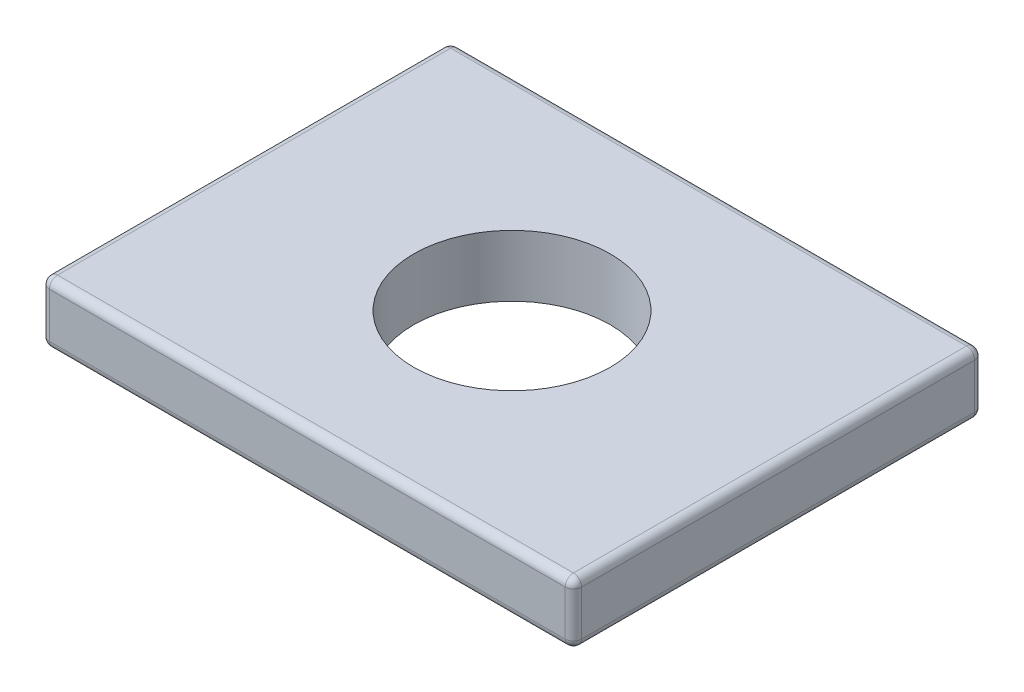
ISO-10303-21;
HEADER;
FILE_DESCRIPTION(('STEP AP214'),'2;1');
FILE_NAME('part.step','',(''),(''),'','','');
FILE_SCHEMA(('AUTOMOTIVE_DESIGN { 1 0 10303 214 1 1 1 1 }'));
ENDSEC;
DATA;
#1=APPLICATION_CONTEXT('core data for automotive mechanical design processes');
#2=APPLICATION_PROTOCOL_DEFINITION('international standard','automotive_design',2000,#1);
#3=PRODUCT_CONTEXT('',#1,'mechanical');
#4=PRODUCT('Part','Part','',(#3));
#5=PRODUCT_RELATED_PRODUCT_CATEGORY('part','',(#4));
#6=PRODUCT_DEFINITION_FORMATION('','',#4);
#7=PRODUCT_DEFINITION_CONTEXT('part definition',#1,'design');
#8=PRODUCT_DEFINITION('design','',#6,#7);
#9=PRODUCT_DEFINITION_SHAPE('','',#8);
#10=(LENGTH_UNIT() NAMED_UNIT(*) SI_UNIT(.MILLI.,.METRE.));
#11=(NAMED_UNIT(*) PLANE_ANGLE_UNIT() SI_UNIT($,.RADIAN.));
#12=(NAMED_UNIT(*) SI_UNIT($,.STERADIAN.) SOLID_ANGLE_UNIT());
#13=UNCERTAINTY_MEASURE_WITH_UNIT(LENGTH_MEASURE(1.E-05),#10,'distance_accuracy_value','');
#14=(GEOMETRIC_REPRESENTATION_CONTEXT(3) GLOBAL_UNCERTAINTY_ASSIGNED_CONTEXT((#13)) GLOBAL_UNIT_ASSIGNED_CONTEXT((#10,
#11,#12)) REPRESENTATION_CONTEXT('',''));
#15=CARTESIAN_POINT('',(0.,0.,0.));
#16=DIRECTION('',(0.,0.,1.));
#17=DIRECTION('',(1.,0.,0.));
#18=AXIS2_PLACEMENT_3D('',#15,#16,#17);
#19=CARTESIAN_POINT('',(-3.25,0.75,-2.5));
#20=DIRECTION('',(1.,0.,0.));
#21=DIRECTION('',(0.,0.,-1.));
#22=AXIS2_PLACEMENT_3D('',#19,#20,#21);
#23=PLANE('',#22);
#24=DIRECTION('',(0.,0.,1.));
#25=VECTOR('',#24,1.);
#26=CARTESIAN_POINT('',(-3.25,0.65,-2.5));
#27=LINE('',#26,#25);
#28=CARTESIAN_POINT('',(-3.25,0.65,2.4));
#29=VERTEX_POINT('',#28);
#30=CARTESIAN_POINT('',(-3.25,0.65,-2.4));
#31=VERTEX_POINT('',#30);
#32=EDGE_CURVE('E136',#29,#31,#27,.F.);
#33=ORIENTED_EDGE('',*,*,#32,.T.);
#34=DIRECTION('',(0.,-1.,0.));
#35=VECTOR('',#34,1.);
#36=CARTESIAN_POINT('',(-3.25,0.75,-2.4));
#37=LINE('',#36,#35);
#38=CARTESIAN_POINT('',(-3.25,0.1,-2.4));
#39=VERTEX_POINT('',#38);
#40=EDGE_CURVE('E183',#31,#39,#37,.T.);
#41=ORIENTED_EDGE('',*,*,#40,.T.);
#42=DIRECTION('',(0.,0.,1.));
#43=VECTOR('',#42,1.);
#44=CARTESIAN_POINT('',(-3.25,0.1,-2.5));
#45=LINE('',#44,#43);
#46=CARTESIAN_POINT('',(-3.25,0.1,2.4));
#47=VERTEX_POINT('',#46);
#48=EDGE_CURVE('E178',#39,#47,#45,.T.);
#49=ORIENTED_EDGE('',*,*,#48,.T.);
#50=DIRECTION('',(0.,-1.,0.));
#51=VECTOR('',#50,1.);
#52=CARTESIAN_POINT('',(-3.25,0.75,2.4));
#53=LINE('',#52,#51);
#54=EDGE_CURVE('E172',#47,#29,#53,.F.);
#55=ORIENTED_EDGE('',*,*,#54,.T.);
#56=EDGE_LOOP('',(#33,#41,#49,#55));
#57=FACE_BOUND('',#56,.T.);
#58=ADVANCED_FACE('F39',(#57),#23,.F.);
#59=CARTESIAN_POINT('',(-3.25,0.75,2.5));
#60=DIRECTION('',(0.,0.,-1.));
#61=DIRECTION('',(-1.,0.,0.));
#62=AXIS2_PLACEMENT_3D('',#59,#60,#61);
#63=PLANE('',#62);
#64=DIRECTION('',(1.,0.,0.));
#65=VECTOR('',#64,1.);
#66=CARTESIAN_POINT('',(-3.25,0.65,2.5));
#67=LINE('',#66,#65);
#68=CARTESIAN_POINT('',(3.15,0.65,2.5));
#69=VERTEX_POINT('',#68);
#70=CARTESIAN_POINT('',(-3.15,0.65,2.5));
#71=VERTEX_POINT('',#70);
#72=EDGE_CURVE('E49',#69,#71,#67,.F.);
#73=ORIENTED_EDGE('',*,*,#72,.T.);
#74=DIRECTION('',(0.,-1.,0.));
#75=VECTOR('',#74,1.);
#76=CARTESIAN_POINT('',(-3.15,0.75,2.5));
#77=LINE('',#76,#75);
#78=CARTESIAN_POINT('',(-3.15,0.1,2.5));
#79=VERTEX_POINT('',#78);
#80=EDGE_CURVE('E11',#71,#79,#77,.T.);
#81=ORIENTED_EDGE('',*,*,#80,.T.);
#82=DIRECTION('',(1.,0.,0.));
#83=VECTOR('',#82,1.);
#84=CARTESIAN_POINT('',(-3.25,0.1,2.5));
#85=LINE('',#84,#83);
#86=CARTESIAN_POINT('',(3.15,0.1,2.5));
#87=VERTEX_POINT('',#86);
#88=EDGE_CURVE('E225',#79,#87,#85,.T.);
#89=ORIENTED_EDGE('',*,*,#88,.T.);
#90=DIRECTION('',(0.,-1.,0.));
#91=VECTOR('',#90,1.);
#92=CARTESIAN_POINT('',(3.15,0.75,2.5));
#93=LINE('',#92,#91);
#94=EDGE_CURVE('E60',#87,#69,#93,.F.);
#95=ORIENTED_EDGE('',*,*,#94,.T.);
#96=EDGE_LOOP('',(#73,#81,#89,#95));
#97=FACE_BOUND('',#96,.T.);
#98=ADVANCED_FACE('F340',(#97),#63,.F.);
#99=CARTESIAN_POINT('',(3.25,0.75,-2.5));
#100=DIRECTION('',(-1.,0.,0.));
#101=DIRECTION('',(0.,0.,1.));
#102=AXIS2_PLACEMENT_3D('',#99,#100,#101);
#103=PLANE('',#102);
#104=DIRECTION('',(0.,0.,-1.));
#105=VECTOR('',#104,1.);
#106=CARTESIAN_POINT('',(3.25,0.1,-2.5));
#107=LINE('',#106,#105);
#108=CARTESIAN_POINT('',(3.25,0.1,2.4));
#109=VERTEX_POINT('',#108);
#110=CARTESIAN_POINT('',(3.25,0.1,-2.4));
#111=VERTEX_POINT('',#110);
#112=EDGE_CURVE('E202',#109,#111,#107,.T.);
#113=ORIENTED_EDGE('',*,*,#112,.T.);
#114=DIRECTION('',(0.,-1.,0.));
#115=VECTOR('',#114,1.);
#116=CARTESIAN_POINT('',(3.25,0.75,-2.4));
#117=LINE('',#116,#115);
#118=CARTESIAN_POINT('',(3.25,0.65,-2.4));
#119=VERTEX_POINT('',#118);
#120=EDGE_CURVE('E209',#111,#119,#117,.F.);
#121=ORIENTED_EDGE('',*,*,#120,.T.);
#122=DIRECTION('',(0.,0.,-1.));
#123=VECTOR('',#122,1.);
#124=CARTESIAN_POINT('',(3.25,0.65,2.5));
#125=LINE('',#124,#123);
#126=CARTESIAN_POINT('',(3.25,0.65,2.4));
#127=VERTEX_POINT('',#126);
#128=EDGE_CURVE('E205',#119,#127,#125,.F.);
#129=ORIENTED_EDGE('',*,*,#128,.T.);
#130=DIRECTION('',(0.,-1.,0.));
#131=VECTOR('',#130,1.);
#132=CARTESIAN_POINT('',(3.25,0.75,2.4));
#133=LINE('',#132,#131);
#134=EDGE_CURVE('E199',#127,#109,#133,.T.);
#135=ORIENTED_EDGE('',*,*,#134,.T.);
#136=EDGE_LOOP('',(#113,#121,#129,#135));
#137=FACE_BOUND('',#136,.T.);
#138=ADVANCED_FACE('F346',(#137),#103,.F.);
#139=CARTESIAN_POINT('',(-3.25,0.75,-2.5));
#140=DIRECTION('',(0.,0.,1.));
#141=DIRECTION('',(1.,0.,0.));
#142=AXIS2_PLACEMENT_3D('',#139,#140,#141);
#143=PLANE('',#142);
#144=DIRECTION('',(-1.,0.,0.));
#145=VECTOR('',#144,1.);
#146=CARTESIAN_POINT('',(3.25,0.65,-2.5));
#147=LINE('',#146,#145);
#148=CARTESIAN_POINT('',(-3.15,0.65,-2.5));
#149=VERTEX_POINT('',#148);
#150=CARTESIAN_POINT('',(3.15,0.65,-2.5));
#151=VERTEX_POINT('',#150);
#152=EDGE_CURVE('E218',#149,#151,#147,.F.);
#153=ORIENTED_EDGE('',*,*,#152,.T.);
#154=DIRECTION('',(0.,-1.,0.));
#155=VECTOR('',#154,1.);
#156=CARTESIAN_POINT('',(3.15,0.75,-2.5));
#157=LINE('',#156,#155);
#158=CARTESIAN_POINT('',(3.15,0.1,-2.5));
#159=VERTEX_POINT('',#158);
#160=EDGE_CURVE('E221',#151,#159,#157,.T.);
#161=ORIENTED_EDGE('',*,*,#160,.T.);
#162=DIRECTION('',(-1.,0.,0.));
#163=VECTOR('',#162,1.);
#164=CARTESIAN_POINT('',(-3.25,0.1,-2.5));
#165=LINE('',#164,#163);
#166=CARTESIAN_POINT('',(-3.15,0.1,-2.5));
#167=VERTEX_POINT('',#166);
#168=EDGE_CURVE('E212',#159,#167,#165,.T.);
#169=ORIENTED_EDGE('',*,*,#168,.T.);
#170=DIRECTION('',(0.,-1.,0.));
#171=VECTOR('',#170,1.);
#172=CARTESIAN_POINT('',(-3.15,0.75,-2.5));
#173=LINE('',#172,#171);
#174=EDGE_CURVE('E215',#167,#149,#173,.F.);
#175=ORIENTED_EDGE('',*,*,#174,.T.);
#176=EDGE_LOOP('',(#153,#161,#169,#175));
#177=FACE_BOUND('',#176,.T.);
#178=ADVANCED_FACE('F434',(#177),#143,.F.);
#179=CARTESIAN_POINT('',(0.,0.75,0.));
#180=DIRECTION('',(0.,1.,0.));
#181=DIRECTION('',(0.,0.,1.));
#182=AXIS2_PLACEMENT_3D('',#179,#180,#181);
#183=PLANE('',#182);
#184=DIRECTION('',(0.,0.,-1.));
#185=VECTOR('',#184,1.);
#186=CARTESIAN_POINT('',(3.15,0.75,-2.5));
#187=LINE('',#186,#185);
#188=CARTESIAN_POINT('',(3.15,0.75,2.4));
#189=VERTEX_POINT('',#188);
#190=CARTESIAN_POINT('',(3.15,0.75,-2.4));
#191=VERTEX_POINT('',#190);
#192=EDGE_CURVE('E160',#189,#191,#187,.T.);
#193=ORIENTED_EDGE('',*,*,#192,.T.);
#194=DIRECTION('',(-1.,0.,0.));
#195=VECTOR('',#194,1.);
#196=CARTESIAN_POINT('',(-3.25,0.75,-2.4));
#197=LINE('',#196,#195);
#198=CARTESIAN_POINT('',(-3.15,0.75,-2.4));
#199=VERTEX_POINT('',#198);
#200=EDGE_CURVE('E166',#191,#199,#197,.T.);
#201=ORIENTED_EDGE('',*,*,#200,.T.);
#202=DIRECTION('',(0.,0.,1.));
#203=VECTOR('',#202,1.);
#204=CARTESIAN_POINT('',(-3.15,0.75,2.5));
#205=LINE('',#204,#203);
#206=CARTESIAN_POINT('',(-3.15,0.75,2.4));
#207=VERTEX_POINT('',#206);
#208=EDGE_CURVE('E134',#199,#207,#205,.T.);
#209=ORIENTED_EDGE('',*,*,#208,.T.);
#210=DIRECTION('',(1.,0.,0.));
#211=VECTOR('',#210,1.);
#212=CARTESIAN_POINT('',(3.25,0.75,2.4));
#213=LINE('',#212,#211);
#214=EDGE_CURVE('E153',#207,#189,#213,.T.);
#215=ORIENTED_EDGE('',*,*,#214,.T.);
#216=EDGE_LOOP('',(#193,#201,#209,#215));
#217=FACE_BOUND('',#216,.T.);
#218=CARTESIAN_POINT('',(0.,0.750000000000001,0.));
#219=DIRECTION('',(0.,1.,0.));
#220=DIRECTION('',(0.,0.,1.));
#221=AXIS2_PLACEMENT_3D('',#218,#219,#220);
#222=CIRCLE('',#221,1.19999999999999);
#223=CARTESIAN_POINT('',(0.,0.750000000000001,1.19999999999999));
#224=VERTEX_POINT('',#223);
#225=EDGE_CURVE('E310',#224,#224,#222,.T.);
#226=ORIENTED_EDGE('',*,*,#225,.F.);
#227=EDGE_LOOP('',(#226));
#228=FACE_BOUND('',#227,.T.);
#229=ADVANCED_FACE('F163',(#217,#228),#183,.T.);
#230=CARTESIAN_POINT('',(0.,0.,0.));
#231=DIRECTION('',(0.,1.,0.));
#232=DIRECTION('',(0.,0.,1.));
#233=AXIS2_PLACEMENT_3D('',#230,#231,#232);
#234=PLANE('',#233);
#235=DIRECTION('',(0.,0.,1.));
#236=VECTOR('',#235,1.);
#237=CARTESIAN_POINT('',(-3.15,0.,0.));
#238=LINE('',#237,#236);
#239=CARTESIAN_POINT('',(-3.15,0.,2.4));
#240=VERTEX_POINT('',#239);
#241=CARTESIAN_POINT('',(-3.15,0.,-2.4));
#242=VERTEX_POINT('',#241);
#243=EDGE_CURVE('E192',#240,#242,#238,.F.);
#244=ORIENTED_EDGE('',*,*,#243,.T.);
#245=DIRECTION('',(-1.,0.,0.));
#246=VECTOR('',#245,1.);
#247=CARTESIAN_POINT('',(0.,0.,-2.4));
#248=LINE('',#247,#246);
#249=CARTESIAN_POINT('',(3.15,0.,-2.4));
#250=VERTEX_POINT('',#249);
#251=EDGE_CURVE('E196',#242,#250,#248,.F.);
#252=ORIENTED_EDGE('',*,*,#251,.T.);
#253=DIRECTION('',(0.,0.,-1.));
#254=VECTOR('',#253,1.);
#255=CARTESIAN_POINT('',(3.15,0.,0.));
#256=LINE('',#255,#254);
#257=CARTESIAN_POINT('',(3.15,0.,2.4));
#258=VERTEX_POINT('',#257);
#259=EDGE_CURVE('E189',#250,#258,#256,.F.);
#260=ORIENTED_EDGE('',*,*,#259,.T.);
#261=DIRECTION('',(1.,0.,0.));
#262=VECTOR('',#261,1.);
#263=CARTESIAN_POINT('',(0.,0.,2.4));
#264=LINE('',#263,#262);
#265=EDGE_CURVE('E186',#258,#240,#264,.F.);
#266=ORIENTED_EDGE('',*,*,#265,.T.);
#267=EDGE_LOOP('',(#244,#252,#260,#266));
#268=FACE_BOUND('',#267,.T.);
#269=CARTESIAN_POINT('',(0.,0.,0.));
#270=DIRECTION('',(0.,1.,0.));
#271=DIRECTION('',(0.,0.,1.));
#272=AXIS2_PLACEMENT_3D('',#269,#270,#271);
#273=CIRCLE('',#272,1.19999999999999);
#274=CARTESIAN_POINT('',(0.,0.,1.19999999999999));
#275=VERTEX_POINT('',#274);
#276=EDGE_CURVE('E161',#275,#275,#273,.T.);
#277=ORIENTED_EDGE('',*,*,#276,.T.);
#278=EDGE_LOOP('',(#277));
#279=FACE_BOUND('',#278,.T.);
#280=ADVANCED_FACE('F325',(#268,#279),#234,.F.);
#281=CARTESIAN_POINT('',(0.,0.75,0.));
#282=DIRECTION('',(0.,1.,0.));
#283=DIRECTION('',(0.,0.,1.));
#284=AXIS2_PLACEMENT_3D('',#281,#282,#283);
#285=CYLINDRICAL_SURFACE('',#284,1.19999999999999);
#286=ORIENTED_EDGE('',*,*,#225,.T.);
#287=EDGE_LOOP('',(#286));
#288=FACE_BOUND('',#287,.T.);
#289=ORIENTED_EDGE('',*,*,#276,.F.);
#290=EDGE_LOOP('',(#289));
#291=FACE_BOUND('',#290,.T.);
#292=ADVANCED_FACE('F327',(#288,#291),#285,.F.);
#293=CARTESIAN_POINT('',(3.15,0.1,-2.5));
#294=DIRECTION('',(0.,0.,-1.));
#295=DIRECTION('',(-1.,0.,0.));
#296=AXIS2_PLACEMENT_3D('',#293,#294,#295);
#297=CYLINDRICAL_SURFACE('',#296,0.1);
#298=CARTESIAN_POINT('',(3.15,0.1,-2.4));
#299=DIRECTION('',(0.,0.,-1.));
#300=DIRECTION('',(-1.,0.,0.));
#301=AXIS2_PLACEMENT_3D('',#298,#299,#300);
#302=CIRCLE('',#301,0.1);
#303=EDGE_CURVE('E43',#111,#250,#302,.T.);
#304=ORIENTED_EDGE('',*,*,#303,.F.);
#305=ORIENTED_EDGE('',*,*,#112,.F.);
#306=CARTESIAN_POINT('',(3.15,0.1,2.4));
#307=DIRECTION('',(0.,0.,1.));
#308=DIRECTION('',(1.,0.,0.));
#309=AXIS2_PLACEMENT_3D('',#306,#307,#308);
#310=CIRCLE('',#309,0.1);
#311=EDGE_CURVE('E301',#258,#109,#310,.T.);
#312=ORIENTED_EDGE('',*,*,#311,.F.);
#313=ORIENTED_EDGE('',*,*,#259,.F.);
#314=EDGE_LOOP('',(#304,#305,#312,#313));
#315=FACE_BOUND('',#314,.T.);
#316=ADVANCED_FACE('F41',(#315),#297,.T.);
#317=CARTESIAN_POINT('',(3.15,0.1,-2.4));
#318=DIRECTION('',(0.,0.,1.));
#319=DIRECTION('',(1.,0.,0.));
#320=AXIS2_PLACEMENT_3D('',#317,#318,#319);
#321=SPHERICAL_SURFACE('',#320,0.1);
#322=CARTESIAN_POINT('',(3.15,0.1,-2.4));
#323=DIRECTION('',(0.,-1.,0.));
#324=DIRECTION('',(0.,0.,-1.));
#325=AXIS2_PLACEMENT_3D('',#322,#323,#324);
#326=CIRCLE('',#325,0.1);
#327=EDGE_CURVE('E294',#111,#159,#326,.F.);
#328=ORIENTED_EDGE('',*,*,#327,.F.);
#329=ORIENTED_EDGE('',*,*,#303,.T.);
#330=CARTESIAN_POINT('',(3.15,0.1,-2.4));
#331=DIRECTION('',(1.,0.,0.));
#332=DIRECTION('',(0.,0.,-1.));
#333=AXIS2_PLACEMENT_3D('',#330,#331,#332);
#334=CIRCLE('',#333,0.1);
#335=EDGE_CURVE('E298',#159,#250,#334,.F.);
#336=ORIENTED_EDGE('',*,*,#335,.F.);
#337=EDGE_LOOP('',(#328,#329,#336));
#338=FACE_BOUND('',#337,.T.);
#339=ADVANCED_FACE('F334',(#338),#321,.T.);
#340=CARTESIAN_POINT('',(3.15,0.1,2.4));
#341=DIRECTION('',(0.,0.,1.));
#342=DIRECTION('',(1.,0.,0.));
#343=AXIS2_PLACEMENT_3D('',#340,#341,#342);
#344=SPHERICAL_SURFACE('',#343,0.1);
#345=CARTESIAN_POINT('',(3.15,0.1,2.4));
#346=DIRECTION('',(1.,0.,0.));
#347=DIRECTION('',(0.,0.,-1.));
#348=AXIS2_PLACEMENT_3D('',#345,#346,#347);
#349=CIRCLE('',#348,0.1);
#350=EDGE_CURVE('E286',#258,#87,#349,.F.);
#351=ORIENTED_EDGE('',*,*,#350,.F.);
#352=ORIENTED_EDGE('',*,*,#311,.T.);
#353=CARTESIAN_POINT('',(3.15,0.1,2.4));
#354=DIRECTION('',(0.,-1.,0.));
#355=DIRECTION('',(0.,0.,-1.));
#356=AXIS2_PLACEMENT_3D('',#353,#354,#355);
#357=CIRCLE('',#356,0.1);
#358=EDGE_CURVE('E290',#87,#109,#357,.F.);
#359=ORIENTED_EDGE('',*,*,#358,.F.);
#360=EDGE_LOOP('',(#351,#352,#359));
#361=FACE_BOUND('',#360,.T.);
#362=ADVANCED_FACE('F411',(#361),#344,.T.);
#363=CARTESIAN_POINT('',(-3.25,0.1,-2.4));
#364=DIRECTION('',(-1.,0.,0.));
#365=DIRECTION('',(0.,0.,1.));
#366=AXIS2_PLACEMENT_3D('',#363,#364,#365);
#367=CYLINDRICAL_SURFACE('',#366,0.1);
#368=ORIENTED_EDGE('',*,*,#335,.T.);
#369=ORIENTED_EDGE('',*,*,#251,.F.);
#370=CARTESIAN_POINT('',(-3.15,0.1,-2.4));
#371=DIRECTION('',(-1.,0.,0.));
#372=DIRECTION('',(0.,0.,1.));
#373=AXIS2_PLACEMENT_3D('',#370,#371,#372);
#374=CIRCLE('',#373,0.1);
#375=EDGE_CURVE('E279',#167,#242,#374,.T.);
#376=ORIENTED_EDGE('',*,*,#375,.F.);
#377=ORIENTED_EDGE('',*,*,#168,.F.);
#378=EDGE_LOOP('',(#368,#369,#376,#377));
#379=FACE_BOUND('',#378,.T.);
#380=ADVANCED_FACE('F407',(#379),#367,.T.);
#381=CARTESIAN_POINT('',(3.15,0.75,-2.4));
#382=DIRECTION('',(0.,-1.,0.));
#383=DIRECTION('',(0.,0.,-1.));
#384=AXIS2_PLACEMENT_3D('',#381,#382,#383);
#385=CYLINDRICAL_SURFACE('',#384,0.1);
#386=ORIENTED_EDGE('',*,*,#327,.T.);
#387=ORIENTED_EDGE('',*,*,#160,.F.);
#388=CARTESIAN_POINT('',(3.15,0.65,-2.4));
#389=DIRECTION('',(0.,1.,0.));
#390=DIRECTION('',(0.,0.,1.));
#391=AXIS2_PLACEMENT_3D('',#388,#389,#390);
#392=CIRCLE('',#391,0.1);
#393=EDGE_CURVE('E275',#119,#151,#392,.T.);
#394=ORIENTED_EDGE('',*,*,#393,.F.);
#395=ORIENTED_EDGE('',*,*,#120,.F.);
#396=EDGE_LOOP('',(#386,#387,#394,#395));
#397=FACE_BOUND('',#396,.T.);
#398=ADVANCED_FACE('F403',(#397),#385,.T.);
#399=CARTESIAN_POINT('',(3.15,0.65,0.));
#400=DIRECTION('',(0.,0.,1.));
#401=DIRECTION('',(1.,0.,0.));
#402=AXIS2_PLACEMENT_3D('',#399,#400,#401);
#403=CYLINDRICAL_SURFACE('',#402,0.1);
#404=CARTESIAN_POINT('',(3.15,0.65,2.4));
#405=DIRECTION('',(0.,0.,1.));
#406=DIRECTION('',(0.,-1.,0.));
#407=AXIS2_PLACEMENT_3D('',#404,#405,#406);
#408=CIRCLE('',#407,0.1);
#409=EDGE_CURVE('E267',#127,#189,#408,.T.);
#410=ORIENTED_EDGE('',*,*,#409,.F.);
#411=ORIENTED_EDGE('',*,*,#128,.F.);
#412=CARTESIAN_POINT('',(3.15,0.65,-2.4));
#413=DIRECTION('',(0.,0.,-1.));
#414=DIRECTION('',(-1.,0.,0.));
#415=AXIS2_PLACEMENT_3D('',#412,#413,#414);
#416=CIRCLE('',#415,0.1);
#417=EDGE_CURVE('E271',#191,#119,#416,.T.);
#418=ORIENTED_EDGE('',*,*,#417,.F.);
#419=ORIENTED_EDGE('',*,*,#192,.F.);
#420=EDGE_LOOP('',(#410,#411,#418,#419));
#421=FACE_BOUND('',#420,.T.);
#422=ADVANCED_FACE('F399',(#421),#403,.T.);
#423=CARTESIAN_POINT('',(3.15,0.75,2.4));
#424=DIRECTION('',(0.,-1.,0.));
#425=DIRECTION('',(0.,0.,-1.));
#426=AXIS2_PLACEMENT_3D('',#423,#424,#425);
#427=CYLINDRICAL_SURFACE('',#426,0.1);
#428=ORIENTED_EDGE('',*,*,#358,.T.);
#429=ORIENTED_EDGE('',*,*,#134,.F.);
#430=CARTESIAN_POINT('',(3.15,0.65,2.4));
#431=DIRECTION('',(0.,1.,0.));
#432=DIRECTION('',(0.,0.,1.));
#433=AXIS2_PLACEMENT_3D('',#430,#431,#432);
#434=CIRCLE('',#433,0.1);
#435=EDGE_CURVE('E264',#69,#127,#434,.T.);
#436=ORIENTED_EDGE('',*,*,#435,.F.);
#437=ORIENTED_EDGE('',*,*,#94,.F.);
#438=EDGE_LOOP('',(#428,#429,#436,#437));
#439=FACE_BOUND('',#438,.T.);
#440=ADVANCED_FACE('F395',(#439),#427,.T.);
#441=CARTESIAN_POINT('',(-3.25,0.1,2.4));
#442=DIRECTION('',(1.,0.,0.));
#443=DIRECTION('',(0.,0.,-1.));
#444=AXIS2_PLACEMENT_3D('',#441,#442,#443);
#445=CYLINDRICAL_SURFACE('',#444,0.1);
#446=ORIENTED_EDGE('',*,*,#350,.T.);
#447=ORIENTED_EDGE('',*,*,#88,.F.);
#448=CARTESIAN_POINT('',(-3.15,0.1,2.4));
#449=DIRECTION('',(-1.,0.,0.));
#450=DIRECTION('',(0.,0.,1.));
#451=AXIS2_PLACEMENT_3D('',#448,#449,#450);
#452=CIRCLE('',#451,0.1);
#453=EDGE_CURVE('E260',#240,#79,#452,.T.);
#454=ORIENTED_EDGE('',*,*,#453,.F.);
#455=ORIENTED_EDGE('',*,*,#265,.F.);
#456=EDGE_LOOP('',(#446,#447,#454,#455));
#457=FACE_BOUND('',#456,.T.);
#458=ADVANCED_FACE('F391',(#457),#445,.T.);
#459=CARTESIAN_POINT('',(-3.15,0.1,-2.5));
#460=DIRECTION('',(0.,0.,1.));
#461=DIRECTION('',(1.,0.,0.));
#462=AXIS2_PLACEMENT_3D('',#459,#460,#461);
#463=CYLINDRICAL_SURFACE('',#462,0.1);
#464=CARTESIAN_POINT('',(-3.15,0.1,-2.4));
#465=DIRECTION('',(0.,0.,-1.));
#466=DIRECTION('',(-1.,0.,0.));
#467=AXIS2_PLACEMENT_3D('',#464,#465,#466);
#468=CIRCLE('',#467,0.1);
#469=EDGE_CURVE('E282',#242,#39,#468,.T.);
#470=ORIENTED_EDGE('',*,*,#469,.F.);
#471=ORIENTED_EDGE('',*,*,#243,.F.);
#472=CARTESIAN_POINT('',(-3.15,0.1,2.4));
#473=DIRECTION('',(0.,0.,1.));
#474=DIRECTION('',(1.,0.,0.));
#475=AXIS2_PLACEMENT_3D('',#472,#473,#474);
#476=CIRCLE('',#475,0.1);
#477=EDGE_CURVE('E256',#47,#240,#476,.T.);
#478=ORIENTED_EDGE('',*,*,#477,.F.);
#479=ORIENTED_EDGE('',*,*,#48,.F.);
#480=EDGE_LOOP('',(#470,#471,#478,#479));
#481=FACE_BOUND('',#480,.T.);
#482=ADVANCED_FACE('F387',(#481),#463,.T.);
#483=CARTESIAN_POINT('',(-3.15,0.1,-2.4));
#484=DIRECTION('',(0.,0.,1.));
#485=DIRECTION('',(1.,0.,0.));
#486=AXIS2_PLACEMENT_3D('',#483,#484,#485);
#487=SPHERICAL_SURFACE('',#486,0.1);
#488=ORIENTED_EDGE('',*,*,#375,.T.);
#489=ORIENTED_EDGE('',*,*,#469,.T.);
#490=CARTESIAN_POINT('',(-3.15,0.1,-2.4));
#491=DIRECTION('',(0.,-1.,0.));
#492=DIRECTION('',(0.,0.,-1.));
#493=AXIS2_PLACEMENT_3D('',#490,#491,#492);
#494=CIRCLE('',#493,0.1);
#495=EDGE_CURVE('E252',#167,#39,#494,.F.);
#496=ORIENTED_EDGE('',*,*,#495,.F.);
#497=EDGE_LOOP('',(#488,#489,#496));
#498=FACE_BOUND('',#497,.T.);
#499=ADVANCED_FACE('F383',(#498),#487,.T.);
#500=CARTESIAN_POINT('',(3.15,0.65,-2.4));
#501=DIRECTION('',(0.,0.,1.));
#502=DIRECTION('',(1.,0.,0.));
#503=AXIS2_PLACEMENT_3D('',#500,#501,#502);
#504=SPHERICAL_SURFACE('',#503,0.1);
#505=ORIENTED_EDGE('',*,*,#417,.T.);
#506=ORIENTED_EDGE('',*,*,#393,.T.);
#507=CARTESIAN_POINT('',(3.15,0.65,-2.4));
#508=DIRECTION('',(1.,0.,0.));
#509=DIRECTION('',(0.,1.,0.));
#510=AXIS2_PLACEMENT_3D('',#507,#508,#509);
#511=CIRCLE('',#510,0.1);
#512=EDGE_CURVE('E248',#191,#151,#511,.F.);
#513=ORIENTED_EDGE('',*,*,#512,.F.);
#514=EDGE_LOOP('',(#505,#506,#513));
#515=FACE_BOUND('',#514,.T.);
#516=ADVANCED_FACE('F379',(#515),#504,.T.);
#517=CARTESIAN_POINT('',(3.15,0.65,2.4));
#518=DIRECTION('',(0.,0.,1.));
#519=DIRECTION('',(1.,0.,0.));
#520=AXIS2_PLACEMENT_3D('',#517,#518,#519);
#521=SPHERICAL_SURFACE('',#520,0.1);
#522=ORIENTED_EDGE('',*,*,#435,.T.);
#523=ORIENTED_EDGE('',*,*,#409,.T.);
#524=CARTESIAN_POINT('',(3.15,0.65,2.4));
#525=DIRECTION('',(1.,0.,0.));
#526=DIRECTION('',(0.,0.,-1.));
#527=AXIS2_PLACEMENT_3D('',#524,#525,#526);
#528=CIRCLE('',#527,0.1);
#529=EDGE_CURVE('E156',#69,#189,#528,.F.);
#530=ORIENTED_EDGE('',*,*,#529,.F.);
#531=EDGE_LOOP('',(#522,#523,#530));
#532=FACE_BOUND('',#531,.T.);
#533=ADVANCED_FACE('F375',(#532),#521,.T.);
#534=CARTESIAN_POINT('',(-3.15,0.1,2.4));
#535=DIRECTION('',(0.,0.,1.));
#536=DIRECTION('',(1.,0.,0.));
#537=AXIS2_PLACEMENT_3D('',#534,#535,#536);
#538=SPHERICAL_SURFACE('',#537,0.1);
#539=ORIENTED_EDGE('',*,*,#477,.T.);
#540=ORIENTED_EDGE('',*,*,#453,.T.);
#541=CARTESIAN_POINT('',(-3.15,0.1,2.4));
#542=DIRECTION('',(0.,-1.,0.));
#543=DIRECTION('',(0.,0.,-1.));
#544=AXIS2_PLACEMENT_3D('',#541,#542,#543);
#545=CIRCLE('',#544,0.1);
#546=EDGE_CURVE('E243',#47,#79,#545,.F.);
#547=ORIENTED_EDGE('',*,*,#546,.F.);
#548=EDGE_LOOP('',(#539,#540,#547));
#549=FACE_BOUND('',#548,.T.);
#550=ADVANCED_FACE('F371',(#549),#538,.T.);
#551=CARTESIAN_POINT('',(-3.15,0.75,-2.4));
#552=DIRECTION('',(0.,-1.,0.));
#553=DIRECTION('',(0.,0.,-1.));
#554=AXIS2_PLACEMENT_3D('',#551,#552,#553);
#555=CYLINDRICAL_SURFACE('',#554,0.1);
#556=ORIENTED_EDGE('',*,*,#495,.T.);
#557=ORIENTED_EDGE('',*,*,#40,.F.);
#558=CARTESIAN_POINT('',(-3.15,0.65,-2.4));
#559=DIRECTION('',(0.,1.,0.));
#560=DIRECTION('',(0.,0.,1.));
#561=AXIS2_PLACEMENT_3D('',#558,#559,#560);
#562=CIRCLE('',#561,0.1);
#563=EDGE_CURVE('E239',#149,#31,#562,.T.);
#564=ORIENTED_EDGE('',*,*,#563,.F.);
#565=ORIENTED_EDGE('',*,*,#174,.F.);
#566=EDGE_LOOP('',(#556,#557,#564,#565));
#567=FACE_BOUND('',#566,.T.);
#568=ADVANCED_FACE('F367',(#567),#555,.T.);
#569=CARTESIAN_POINT('',(0.,0.65,-2.4));
#570=DIRECTION('',(1.,0.,0.));
#571=DIRECTION('',(0.,0.,-1.));
#572=AXIS2_PLACEMENT_3D('',#569,#570,#571);
#573=CYLINDRICAL_SURFACE('',#572,0.1);
#574=ORIENTED_EDGE('',*,*,#512,.T.);
#575=ORIENTED_EDGE('',*,*,#152,.F.);
#576=CARTESIAN_POINT('',(-3.15,0.65,-2.4));
#577=DIRECTION('',(-1.,0.,0.));
#578=DIRECTION('',(0.,0.,1.));
#579=AXIS2_PLACEMENT_3D('',#576,#577,#578);
#580=CIRCLE('',#579,0.1);
#581=EDGE_CURVE('E150',#199,#149,#580,.T.);
#582=ORIENTED_EDGE('',*,*,#581,.F.);
#583=ORIENTED_EDGE('',*,*,#200,.F.);
#584=EDGE_LOOP('',(#574,#575,#582,#583));
#585=FACE_BOUND('',#584,.T.);
#586=ADVANCED_FACE('F364',(#585),#573,.T.);
#587=CARTESIAN_POINT('',(0.,0.65,2.4));
#588=DIRECTION('',(-1.,0.,0.));
#589=DIRECTION('',(0.,0.,1.));
#590=AXIS2_PLACEMENT_3D('',#587,#588,#589);
#591=CYLINDRICAL_SURFACE('',#590,0.1);
#592=ORIENTED_EDGE('',*,*,#529,.T.);
#593=ORIENTED_EDGE('',*,*,#214,.F.);
#594=CARTESIAN_POINT('',(-3.15,0.65,2.4));
#595=DIRECTION('',(-1.,0.,0.));
#596=DIRECTION('',(0.,0.,1.));
#597=AXIS2_PLACEMENT_3D('',#594,#595,#596);
#598=CIRCLE('',#597,0.1);
#599=EDGE_CURVE('E143',#71,#207,#598,.T.);
#600=ORIENTED_EDGE('',*,*,#599,.F.);
#601=ORIENTED_EDGE('',*,*,#72,.F.);
#602=EDGE_LOOP('',(#592,#593,#600,#601));
#603=FACE_BOUND('',#602,.T.);
#604=ADVANCED_FACE('F154',(#603),#591,.T.);
#605=CARTESIAN_POINT('',(-3.15,0.75,2.4));
#606=DIRECTION('',(0.,-1.,0.));
#607=DIRECTION('',(0.,0.,-1.));
#608=AXIS2_PLACEMENT_3D('',#605,#606,#607);
#609=CYLINDRICAL_SURFACE('',#608,0.1);
#610=ORIENTED_EDGE('',*,*,#546,.T.);
#611=ORIENTED_EDGE('',*,*,#80,.F.);
#612=CARTESIAN_POINT('',(-3.15,0.65,2.4));
#613=DIRECTION('',(0.,1.,0.));
#614=DIRECTION('',(0.,0.,1.));
#615=AXIS2_PLACEMENT_3D('',#612,#613,#614);
#616=CIRCLE('',#615,0.1);
#617=EDGE_CURVE('E147',#29,#71,#616,.T.);
#618=ORIENTED_EDGE('',*,*,#617,.F.);
#619=ORIENTED_EDGE('',*,*,#54,.F.);
#620=EDGE_LOOP('',(#610,#611,#618,#619));
#621=FACE_BOUND('',#620,.T.);
#622=ADVANCED_FACE('F357',(#621),#609,.T.);
#623=CARTESIAN_POINT('',(-3.15,0.65,-2.4));
#624=DIRECTION('',(0.,0.,1.));
#625=DIRECTION('',(1.,0.,0.));
#626=AXIS2_PLACEMENT_3D('',#623,#624,#625);
#627=SPHERICAL_SURFACE('',#626,0.1);
#628=ORIENTED_EDGE('',*,*,#581,.T.);
#629=ORIENTED_EDGE('',*,*,#563,.T.);
#630=CARTESIAN_POINT('',(-3.15,0.65,-2.4));
#631=DIRECTION('',(0.,0.,-1.));
#632=DIRECTION('',(-1.,0.,0.));
#633=AXIS2_PLACEMENT_3D('',#630,#631,#632);
#634=CIRCLE('',#633,0.1);
#635=EDGE_CURVE('E140',#199,#31,#634,.F.);
#636=ORIENTED_EDGE('',*,*,#635,.F.);
#637=EDGE_LOOP('',(#628,#629,#636));
#638=FACE_BOUND('',#637,.T.);
#639=ADVANCED_FACE('F354',(#638),#627,.T.);
#640=CARTESIAN_POINT('',(-3.15,0.65,2.4));
#641=DIRECTION('',(0.,0.,1.));
#642=DIRECTION('',(1.,0.,0.));
#643=AXIS2_PLACEMENT_3D('',#640,#641,#642);
#644=SPHERICAL_SURFACE('',#643,0.1);
#645=ORIENTED_EDGE('',*,*,#617,.T.);
#646=ORIENTED_EDGE('',*,*,#599,.T.);
#647=CARTESIAN_POINT('',(-3.15,0.65,2.4));
#648=DIRECTION('',(0.,0.,1.));
#649=DIRECTION('',(1.,0.,0.));
#650=AXIS2_PLACEMENT_3D('',#647,#648,#649);
#651=CIRCLE('',#650,0.1);
#652=EDGE_CURVE('E130',#29,#207,#651,.F.);
#653=ORIENTED_EDGE('',*,*,#652,.F.);
#654=EDGE_LOOP('',(#645,#646,#653));
#655=FACE_BOUND('',#654,.T.);
#656=ADVANCED_FACE('F145',(#655),#644,.T.);
#657=CARTESIAN_POINT('',(-3.15,0.65,0.));
#658=DIRECTION('',(0.,0.,-1.));
#659=DIRECTION('',(-1.,0.,0.));
#660=AXIS2_PLACEMENT_3D('',#657,#658,#659);
#661=CYLINDRICAL_SURFACE('',#660,0.1);
#662=ORIENTED_EDGE('',*,*,#635,.T.);
#663=ORIENTED_EDGE('',*,*,#32,.F.);
#664=ORIENTED_EDGE('',*,*,#652,.T.);
#665=ORIENTED_EDGE('',*,*,#208,.F.);
#666=EDGE_LOOP('',(#662,#663,#664,#665));
#667=FACE_BOUND('',#666,.T.);
#668=ADVANCED_FACE('F132',(#667),#661,.T.);
#669=CLOSED_SHELL('',(#58,#98,#138,#178,#229,#280,#292,#316,#339,#362,#380,#398,#422,#440,#458,
#482,#499,#516,#533,#550,#568,#586,#604,#622,#639,#656,#668));
#670=MANIFOLD_SOLID_BREP('B2',#669);
#671=ADVANCED_BREP_SHAPE_REPRESENTATION('',(#18,#670),#14);
#672=SHAPE_DEFINITION_REPRESENTATION(#9,#671);
ENDSEC;
END-ISO-10303-21;
